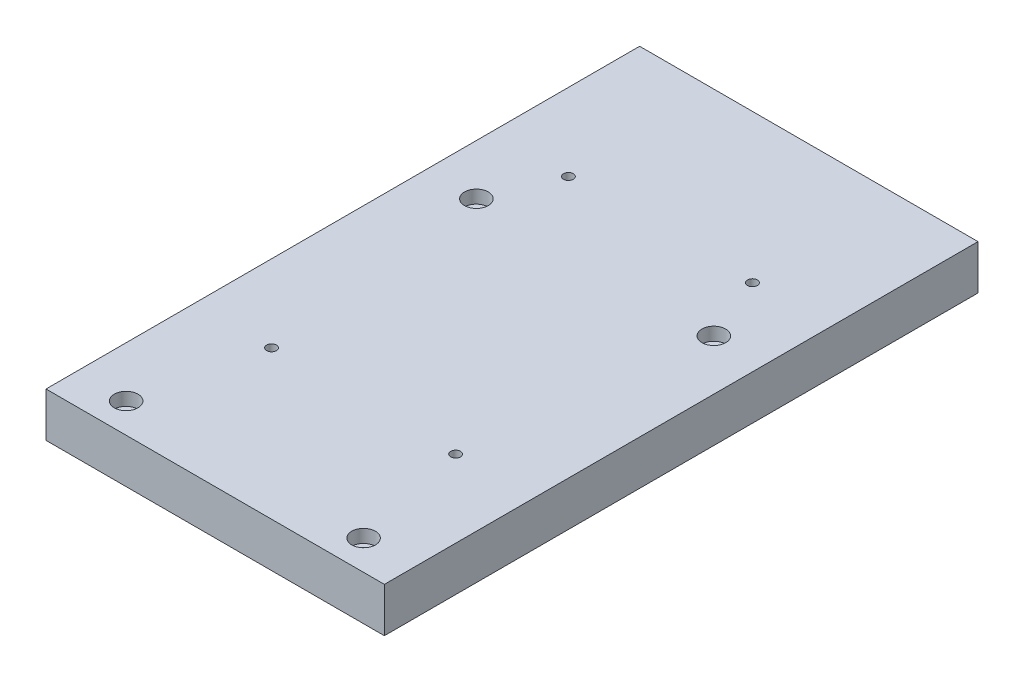
ISO-10303-21;
HEADER;
FILE_DESCRIPTION(('STEP AP214'),'2;1');
FILE_NAME('part.step','',(''),(''),'','','');
FILE_SCHEMA(('AUTOMOTIVE_DESIGN { 1 0 10303 214 1 1 1 1 }'));
ENDSEC;
DATA;
#1=APPLICATION_CONTEXT('core data for automotive mechanical design processes');
#2=APPLICATION_PROTOCOL_DEFINITION('international standard','automotive_design',2000,#1);
#3=PRODUCT_CONTEXT('',#1,'mechanical');
#4=PRODUCT('Part','Part','',(#3));
#5=PRODUCT_RELATED_PRODUCT_CATEGORY('part','',(#4));
#6=PRODUCT_DEFINITION_FORMATION('','',#4);
#7=PRODUCT_DEFINITION_CONTEXT('part definition',#1,'design');
#8=PRODUCT_DEFINITION('design','',#6,#7);
#9=PRODUCT_DEFINITION_SHAPE('','',#8);
#10=(LENGTH_UNIT() NAMED_UNIT(*) SI_UNIT(.MILLI.,.METRE.));
#11=(NAMED_UNIT(*) PLANE_ANGLE_UNIT() SI_UNIT($,.RADIAN.));
#12=(NAMED_UNIT(*) SI_UNIT($,.STERADIAN.) SOLID_ANGLE_UNIT());
#13=UNCERTAINTY_MEASURE_WITH_UNIT(LENGTH_MEASURE(1.E-05),#10,'distance_accuracy_value','');
#14=(GEOMETRIC_REPRESENTATION_CONTEXT(3) GLOBAL_UNCERTAINTY_ASSIGNED_CONTEXT((#13)) GLOBAL_UNIT_ASSIGNED_CONTEXT((#10,
#11,#12)) REPRESENTATION_CONTEXT('',''));
#15=CARTESIAN_POINT('',(0.,0.,0.));
#16=DIRECTION('',(0.,0.,1.));
#17=DIRECTION('',(1.,0.,0.));
#18=AXIS2_PLACEMENT_3D('',#15,#16,#17);
#19=CARTESIAN_POINT('',(31.,15.,-50.));
#20=DIRECTION('',(0.,1.,0.));
#21=DIRECTION('',(0.,0.,1.));
#22=AXIS2_PLACEMENT_3D('',#19,#20,#21);
#23=CYLINDRICAL_SURFACE('',#22,1.65);
#24=CARTESIAN_POINT('',(31.,4.9,-50.));
#25=DIRECTION('',(0.,1.,0.));
#26=DIRECTION('',(0.,0.,1.));
#27=AXIS2_PLACEMENT_3D('',#24,#25,#26);
#28=CIRCLE('',#27,1.65);
#29=CARTESIAN_POINT('',(31.,4.9,-48.35));
#30=VERTEX_POINT('',#29);
#31=EDGE_CURVE('E11',#30,#30,#28,.T.);
#32=ORIENTED_EDGE('',*,*,#31,.F.);
#33=EDGE_LOOP('',(#32));
#34=FACE_BOUND('',#33,.T.);
#35=CARTESIAN_POINT('',(31.,15.,-50.));
#36=DIRECTION('',(0.,1.,0.));
#37=DIRECTION('',(0.,0.,1.));
#38=AXIS2_PLACEMENT_3D('',#35,#36,#37);
#39=CIRCLE('',#38,1.64999999999999);
#40=CARTESIAN_POINT('',(31.,15.,-48.35));
#41=VERTEX_POINT('',#40);
#42=EDGE_CURVE('E45',#41,#41,#39,.T.);
#43=ORIENTED_EDGE('',*,*,#42,.T.);
#44=EDGE_LOOP('',(#43));
#45=FACE_BOUND('',#44,.T.);
#46=ADVANCED_FACE('F38',(#34,#45),#23,.F.);
#47=CARTESIAN_POINT('',(31.,4.9,-50.));
#48=DIRECTION('',(0.,1.,0.));
#49=DIRECTION('',(0.,0.,1.));
#50=AXIS2_PLACEMENT_3D('',#47,#48,#49);
#51=CONICAL_SURFACE('',#50,1.65,1.02974425867665);
#52=CARTESIAN_POINT('',(31.,3.90857997860452,-50.));
#53=VERTEX_POINT('',#52);
#54=VERTEX_LOOP('',#53);
#55=FACE_BOUND('',#54,.T.);
#56=ORIENTED_EDGE('',*,*,#31,.T.);
#57=EDGE_LOOP('',(#56));
#58=FACE_BOUND('',#57,.T.);
#59=ADVANCED_FACE('F210',(#55,#58),#51,.F.);
#60=CARTESIAN_POINT('',(31.,15.,50.));
#61=DIRECTION('',(0.,1.,0.));
#62=DIRECTION('',(0.,0.,1.));
#63=AXIS2_PLACEMENT_3D('',#60,#61,#62);
#64=CYLINDRICAL_SURFACE('',#63,1.65);
#65=CARTESIAN_POINT('',(31.,4.9,50.));
#66=DIRECTION('',(0.,1.,0.));
#67=DIRECTION('',(0.,0.,1.));
#68=AXIS2_PLACEMENT_3D('',#65,#66,#67);
#69=CIRCLE('',#68,1.65);
#70=CARTESIAN_POINT('',(31.,4.9,51.65));
#71=VERTEX_POINT('',#70);
#72=EDGE_CURVE('E184',#71,#71,#69,.T.);
#73=ORIENTED_EDGE('',*,*,#72,.F.);
#74=EDGE_LOOP('',(#73));
#75=FACE_BOUND('',#74,.T.);
#76=CARTESIAN_POINT('',(31.,15.,50.));
#77=DIRECTION('',(0.,1.,0.));
#78=DIRECTION('',(0.,0.,1.));
#79=AXIS2_PLACEMENT_3D('',#76,#77,#78);
#80=CIRCLE('',#79,1.64999999999999);
#81=CARTESIAN_POINT('',(31.,15.,51.65));
#82=VERTEX_POINT('',#81);
#83=EDGE_CURVE('E181',#82,#82,#80,.T.);
#84=ORIENTED_EDGE('',*,*,#83,.T.);
#85=EDGE_LOOP('',(#84));
#86=FACE_BOUND('',#85,.T.);
#87=ADVANCED_FACE('F215',(#75,#86),#64,.F.);
#88=CARTESIAN_POINT('',(31.,4.9,50.));
#89=DIRECTION('',(0.,1.,0.));
#90=DIRECTION('',(0.,0.,1.));
#91=AXIS2_PLACEMENT_3D('',#88,#89,#90);
#92=CONICAL_SURFACE('',#91,1.65,1.02974425867665);
#93=CARTESIAN_POINT('',(31.,3.90857997860452,50.));
#94=VERTEX_POINT('',#93);
#95=VERTEX_LOOP('',#94);
#96=FACE_BOUND('',#95,.T.);
#97=ORIENTED_EDGE('',*,*,#72,.T.);
#98=EDGE_LOOP('',(#97));
#99=FACE_BOUND('',#98,.T.);
#100=ADVANCED_FACE('F221',(#96,#99),#92,.F.);
#101=CARTESIAN_POINT('',(40.,15.,-28.));
#102=DIRECTION('',(0.,1.,0.));
#103=DIRECTION('',(0.,0.,1.));
#104=AXIS2_PLACEMENT_3D('',#101,#102,#103);
#105=CYLINDRICAL_SURFACE('',#104,4.);
#106=CARTESIAN_POINT('',(40.,10.6,-28.));
#107=DIRECTION('',(0.,1.,0.));
#108=DIRECTION('',(0.,0.,1.));
#109=AXIS2_PLACEMENT_3D('',#106,#107,#108);
#110=CIRCLE('',#109,4.);
#111=CARTESIAN_POINT('',(40.,10.6,-24.));
#112=VERTEX_POINT('',#111);
#113=EDGE_CURVE('E178',#112,#112,#110,.T.);
#114=ORIENTED_EDGE('',*,*,#113,.F.);
#115=EDGE_LOOP('',(#114));
#116=FACE_BOUND('',#115,.T.);
#117=CARTESIAN_POINT('',(40.,15.,-28.));
#118=DIRECTION('',(0.,1.,0.));
#119=DIRECTION('',(0.,0.,1.));
#120=AXIS2_PLACEMENT_3D('',#117,#118,#119);
#121=CIRCLE('',#120,4.);
#122=CARTESIAN_POINT('',(40.,15.,-24.));
#123=VERTEX_POINT('',#122);
#124=EDGE_CURVE('E169',#123,#123,#121,.T.);
#125=ORIENTED_EDGE('',*,*,#124,.T.);
#126=EDGE_LOOP('',(#125));
#127=FACE_BOUND('',#126,.T.);
#128=ADVANCED_FACE('F227',(#116,#127),#105,.F.);
#129=CARTESIAN_POINT('',(42.25,10.6,-28.));
#130=DIRECTION('',(0.,-1.,0.));
#131=DIRECTION('',(0.,0.,-1.));
#132=AXIS2_PLACEMENT_3D('',#129,#130,#131);
#133=PLANE('',#132);
#134=CARTESIAN_POINT('',(40.,10.6,-28.));
#135=DIRECTION('',(0.,1.,0.));
#136=DIRECTION('',(0.,0.,1.));
#137=AXIS2_PLACEMENT_3D('',#134,#135,#136);
#138=CIRCLE('',#137,2.25);
#139=CARTESIAN_POINT('',(40.,10.6,-25.75));
#140=VERTEX_POINT('',#139);
#141=EDGE_CURVE('E175',#140,#140,#138,.T.);
#142=ORIENTED_EDGE('',*,*,#141,.F.);
#143=EDGE_LOOP('',(#142));
#144=FACE_BOUND('',#143,.T.);
#145=ORIENTED_EDGE('',*,*,#113,.T.);
#146=EDGE_LOOP('',(#145));
#147=FACE_BOUND('',#146,.T.);
#148=ADVANCED_FACE('F230',(#144,#147),#133,.F.);
#149=CARTESIAN_POINT('',(40.,15.,-28.));
#150=DIRECTION('',(0.,1.,0.));
#151=DIRECTION('',(0.,0.,1.));
#152=AXIS2_PLACEMENT_3D('',#149,#150,#151);
#153=CYLINDRICAL_SURFACE('',#152,2.25);
#154=CARTESIAN_POINT('',(40.,0.,-28.));
#155=DIRECTION('',(0.,1.,0.));
#156=DIRECTION('',(0.,0.,1.));
#157=AXIS2_PLACEMENT_3D('',#154,#155,#156);
#158=CIRCLE('',#157,2.25);
#159=CARTESIAN_POINT('',(40.,0.,-25.75));
#160=VERTEX_POINT('',#159);
#161=EDGE_CURVE('E172',#160,#160,#158,.T.);
#162=ORIENTED_EDGE('',*,*,#161,.F.);
#163=EDGE_LOOP('',(#162));
#164=FACE_BOUND('',#163,.T.);
#165=ORIENTED_EDGE('',*,*,#141,.T.);
#166=EDGE_LOOP('',(#165));
#167=FACE_BOUND('',#166,.T.);
#168=ADVANCED_FACE('F234',(#164,#167),#153,.F.);
#169=CARTESIAN_POINT('',(40.,15.,90.));
#170=DIRECTION('',(0.,1.,0.));
#171=DIRECTION('',(0.,0.,1.));
#172=AXIS2_PLACEMENT_3D('',#169,#170,#171);
#173=CYLINDRICAL_SURFACE('',#172,4.);
#174=CARTESIAN_POINT('',(40.,10.6,90.));
#175=DIRECTION('',(0.,1.,0.));
#176=DIRECTION('',(0.,0.,1.));
#177=AXIS2_PLACEMENT_3D('',#174,#175,#176);
#178=CIRCLE('',#177,4.);
#179=CARTESIAN_POINT('',(40.,10.6,94.));
#180=VERTEX_POINT('',#179);
#181=EDGE_CURVE('E166',#180,#180,#178,.T.);
#182=ORIENTED_EDGE('',*,*,#181,.F.);
#183=EDGE_LOOP('',(#182));
#184=FACE_BOUND('',#183,.T.);
#185=CARTESIAN_POINT('',(40.,15.,90.));
#186=DIRECTION('',(0.,1.,0.));
#187=DIRECTION('',(0.,0.,1.));
#188=AXIS2_PLACEMENT_3D('',#185,#186,#187);
#189=CIRCLE('',#188,4.);
#190=CARTESIAN_POINT('',(40.,15.,94.));
#191=VERTEX_POINT('',#190);
#192=EDGE_CURVE('E157',#191,#191,#189,.T.);
#193=ORIENTED_EDGE('',*,*,#192,.T.);
#194=EDGE_LOOP('',(#193));
#195=FACE_BOUND('',#194,.T.);
#196=ADVANCED_FACE('F238',(#184,#195),#173,.F.);
#197=CARTESIAN_POINT('',(42.25,10.6,90.));
#198=DIRECTION('',(0.,-1.,0.));
#199=DIRECTION('',(0.,0.,-1.));
#200=AXIS2_PLACEMENT_3D('',#197,#198,#199);
#201=PLANE('',#200);
#202=CARTESIAN_POINT('',(40.,10.6,90.));
#203=DIRECTION('',(0.,1.,0.));
#204=DIRECTION('',(0.,0.,1.));
#205=AXIS2_PLACEMENT_3D('',#202,#203,#204);
#206=CIRCLE('',#205,2.25);
#207=CARTESIAN_POINT('',(40.,10.6,92.25));
#208=VERTEX_POINT('',#207);
#209=EDGE_CURVE('E163',#208,#208,#206,.T.);
#210=ORIENTED_EDGE('',*,*,#209,.F.);
#211=EDGE_LOOP('',(#210));
#212=FACE_BOUND('',#211,.T.);
#213=ORIENTED_EDGE('',*,*,#181,.T.);
#214=EDGE_LOOP('',(#213));
#215=FACE_BOUND('',#214,.T.);
#216=ADVANCED_FACE('F242',(#212,#215),#201,.F.);
#217=CARTESIAN_POINT('',(40.,15.,90.));
#218=DIRECTION('',(0.,1.,0.));
#219=DIRECTION('',(0.,0.,1.));
#220=AXIS2_PLACEMENT_3D('',#217,#218,#219);
#221=CYLINDRICAL_SURFACE('',#220,2.25);
#222=CARTESIAN_POINT('',(40.,0.,90.));
#223=DIRECTION('',(0.,1.,0.));
#224=DIRECTION('',(0.,0.,1.));
#225=AXIS2_PLACEMENT_3D('',#222,#223,#224);
#226=CIRCLE('',#225,2.25);
#227=CARTESIAN_POINT('',(40.,0.,92.25));
#228=VERTEX_POINT('',#227);
#229=EDGE_CURVE('E160',#228,#228,#226,.T.);
#230=ORIENTED_EDGE('',*,*,#229,.F.);
#231=EDGE_LOOP('',(#230));
#232=FACE_BOUND('',#231,.T.);
#233=ORIENTED_EDGE('',*,*,#209,.T.);
#234=EDGE_LOOP('',(#233));
#235=FACE_BOUND('',#234,.T.);
#236=ADVANCED_FACE('F246',(#232,#235),#221,.F.);
#237=CARTESIAN_POINT('',(57.,15.,-100.));
#238=DIRECTION('',(-1.,0.,0.));
#239=DIRECTION('',(0.,0.,1.));
#240=AXIS2_PLACEMENT_3D('',#237,#238,#239);
#241=PLANE('',#240);
#242=DIRECTION('',(0.,0.,-1.));
#243=VECTOR('',#242,1.);
#244=CARTESIAN_POINT('',(57.,0.,-100.));
#245=LINE('',#244,#243);
#246=CARTESIAN_POINT('',(57.,0.,100.));
#247=VERTEX_POINT('',#246);
#248=CARTESIAN_POINT('',(57.,0.,-100.));
#249=VERTEX_POINT('',#248);
#250=EDGE_CURVE('E127',#247,#249,#245,.T.);
#251=ORIENTED_EDGE('',*,*,#250,.T.);
#252=DIRECTION('',(0.,-1.,0.));
#253=VECTOR('',#252,1.);
#254=CARTESIAN_POINT('',(57.,15.,-100.));
#255=LINE('',#254,#253);
#256=CARTESIAN_POINT('',(57.,15.,-100.));
#257=VERTEX_POINT('',#256);
#258=EDGE_CURVE('E154',#257,#249,#255,.T.);
#259=ORIENTED_EDGE('',*,*,#258,.F.);
#260=DIRECTION('',(0.,0.,-1.));
#261=VECTOR('',#260,1.);
#262=CARTESIAN_POINT('',(57.,15.,-100.));
#263=LINE('',#262,#261);
#264=CARTESIAN_POINT('',(57.,15.,100.));
#265=VERTEX_POINT('',#264);
#266=EDGE_CURVE('E128',#265,#257,#263,.T.);
#267=ORIENTED_EDGE('',*,*,#266,.F.);
#268=DIRECTION('',(0.,-1.,0.));
#269=VECTOR('',#268,1.);
#270=CARTESIAN_POINT('',(57.,15.,100.));
#271=LINE('',#270,#269);
#272=EDGE_CURVE('E138',#265,#247,#271,.T.);
#273=ORIENTED_EDGE('',*,*,#272,.T.);
#274=EDGE_LOOP('',(#251,#259,#267,#273));
#275=FACE_BOUND('',#274,.T.);
#276=ADVANCED_FACE('F250',(#275),#241,.F.);
#277=CARTESIAN_POINT('',(-57.,15.,-100.));
#278=DIRECTION('',(0.,0.,1.));
#279=DIRECTION('',(1.,0.,0.));
#280=AXIS2_PLACEMENT_3D('',#277,#278,#279);
#281=PLANE('',#280);
#282=DIRECTION('',(-1.,0.,0.));
#283=VECTOR('',#282,1.);
#284=CARTESIAN_POINT('',(-57.,0.,-100.));
#285=LINE('',#284,#283);
#286=CARTESIAN_POINT('',(-57.,0.,-100.));
#287=VERTEX_POINT('',#286);
#288=EDGE_CURVE('E141',#249,#287,#285,.T.);
#289=ORIENTED_EDGE('',*,*,#288,.T.);
#290=DIRECTION('',(0.,-1.,0.));
#291=VECTOR('',#290,1.);
#292=CARTESIAN_POINT('',(-57.,15.,-100.));
#293=LINE('',#292,#291);
#294=CARTESIAN_POINT('',(-57.,15.,-100.));
#295=VERTEX_POINT('',#294);
#296=EDGE_CURVE('E151',#295,#287,#293,.T.);
#297=ORIENTED_EDGE('',*,*,#296,.F.);
#298=DIRECTION('',(-1.,0.,0.));
#299=VECTOR('',#298,1.);
#300=CARTESIAN_POINT('',(-57.,15.,-100.));
#301=LINE('',#300,#299);
#302=EDGE_CURVE('E131',#257,#295,#301,.T.);
#303=ORIENTED_EDGE('',*,*,#302,.F.);
#304=ORIENTED_EDGE('',*,*,#258,.T.);
#305=EDGE_LOOP('',(#289,#297,#303,#304));
#306=FACE_BOUND('',#305,.T.);
#307=ADVANCED_FACE('F254',(#306),#281,.F.);
#308=CARTESIAN_POINT('',(-57.,15.,-100.));
#309=DIRECTION('',(1.,0.,0.));
#310=DIRECTION('',(0.,0.,-1.));
#311=AXIS2_PLACEMENT_3D('',#308,#309,#310);
#312=PLANE('',#311);
#313=DIRECTION('',(0.,0.,1.));
#314=VECTOR('',#313,1.);
#315=CARTESIAN_POINT('',(-57.,0.,-100.));
#316=LINE('',#315,#314);
#317=CARTESIAN_POINT('',(-57.,0.,100.));
#318=VERTEX_POINT('',#317);
#319=EDGE_CURVE('E143',#287,#318,#316,.T.);
#320=ORIENTED_EDGE('',*,*,#319,.T.);
#321=DIRECTION('',(0.,-1.,0.));
#322=VECTOR('',#321,1.);
#323=CARTESIAN_POINT('',(-57.,15.,100.));
#324=LINE('',#323,#322);
#325=CARTESIAN_POINT('',(-57.,15.,100.));
#326=VERTEX_POINT('',#325);
#327=EDGE_CURVE('E148',#326,#318,#324,.T.);
#328=ORIENTED_EDGE('',*,*,#327,.F.);
#329=DIRECTION('',(0.,0.,1.));
#330=VECTOR('',#329,1.);
#331=CARTESIAN_POINT('',(-57.,15.,-100.));
#332=LINE('',#331,#330);
#333=EDGE_CURVE('E134',#295,#326,#332,.T.);
#334=ORIENTED_EDGE('',*,*,#333,.F.);
#335=ORIENTED_EDGE('',*,*,#296,.T.);
#336=EDGE_LOOP('',(#320,#328,#334,#335));
#337=FACE_BOUND('',#336,.T.);
#338=ADVANCED_FACE('F203',(#337),#312,.F.);
#339=CARTESIAN_POINT('',(-57.,15.,100.));
#340=DIRECTION('',(0.,0.,-1.));
#341=DIRECTION('',(-1.,0.,0.));
#342=AXIS2_PLACEMENT_3D('',#339,#340,#341);
#343=PLANE('',#342);
#344=DIRECTION('',(1.,0.,0.));
#345=VECTOR('',#344,1.);
#346=CARTESIAN_POINT('',(-57.,0.,100.));
#347=LINE('',#346,#345);
#348=EDGE_CURVE('E132',#318,#247,#347,.T.);
#349=ORIENTED_EDGE('',*,*,#348,.T.);
#350=ORIENTED_EDGE('',*,*,#272,.F.);
#351=DIRECTION('',(1.,0.,0.));
#352=VECTOR('',#351,1.);
#353=CARTESIAN_POINT('',(-57.,15.,100.));
#354=LINE('',#353,#352);
#355=EDGE_CURVE('E136',#326,#265,#354,.T.);
#356=ORIENTED_EDGE('',*,*,#355,.F.);
#357=ORIENTED_EDGE('',*,*,#327,.T.);
#358=EDGE_LOOP('',(#349,#350,#356,#357));
#359=FACE_BOUND('',#358,.T.);
#360=ADVANCED_FACE('F193',(#359),#343,.F.);
#361=CARTESIAN_POINT('',(0.,15.,0.));
#362=DIRECTION('',(0.,1.,0.));
#363=DIRECTION('',(0.,0.,1.));
#364=AXIS2_PLACEMENT_3D('',#361,#362,#363);
#365=PLANE('',#364);
#366=CARTESIAN_POINT('',(-31.,15.,-50.));
#367=DIRECTION('',(0.,1.,0.));
#368=DIRECTION('',(0.,0.,1.));
#369=AXIS2_PLACEMENT_3D('',#366,#367,#368);
#370=CIRCLE('',#369,1.64999999999999);
#371=CARTESIAN_POINT('',(-31.,15.,-48.35));
#372=VERTEX_POINT('',#371);
#373=EDGE_CURVE('E93',#372,#372,#370,.T.);
#374=ORIENTED_EDGE('',*,*,#373,.F.);
#375=EDGE_LOOP('',(#374));
#376=FACE_BOUND('',#375,.T.);
#377=CARTESIAN_POINT('',(-31.,15.,50.));
#378=DIRECTION('',(0.,1.,0.));
#379=DIRECTION('',(0.,0.,1.));
#380=AXIS2_PLACEMENT_3D('',#377,#378,#379);
#381=CIRCLE('',#380,1.64999999999999);
#382=CARTESIAN_POINT('',(-31.,15.,51.65));
#383=VERTEX_POINT('',#382);
#384=EDGE_CURVE('E92',#383,#383,#381,.T.);
#385=ORIENTED_EDGE('',*,*,#384,.F.);
#386=EDGE_LOOP('',(#385));
#387=FACE_BOUND('',#386,.T.);
#388=CARTESIAN_POINT('',(-40.,15.,-28.));
#389=DIRECTION('',(0.,1.,0.));
#390=DIRECTION('',(0.,0.,1.));
#391=AXIS2_PLACEMENT_3D('',#388,#389,#390);
#392=CIRCLE('',#391,4.);
#393=CARTESIAN_POINT('',(-40.,15.,-24.));
#394=VERTEX_POINT('',#393);
#395=EDGE_CURVE('E103',#394,#394,#392,.T.);
#396=ORIENTED_EDGE('',*,*,#395,.F.);
#397=EDGE_LOOP('',(#396));
#398=FACE_BOUND('',#397,.T.);
#399=CARTESIAN_POINT('',(-40.,15.,90.));
#400=DIRECTION('',(0.,1.,0.));
#401=DIRECTION('',(0.,0.,1.));
#402=AXIS2_PLACEMENT_3D('',#399,#400,#401);
#403=CIRCLE('',#402,4.);
#404=CARTESIAN_POINT('',(-40.,15.,94.));
#405=VERTEX_POINT('',#404);
#406=EDGE_CURVE('E115',#405,#405,#403,.T.);
#407=ORIENTED_EDGE('',*,*,#406,.F.);
#408=EDGE_LOOP('',(#407));
#409=FACE_BOUND('',#408,.T.);
#410=ORIENTED_EDGE('',*,*,#266,.T.);
#411=ORIENTED_EDGE('',*,*,#302,.T.);
#412=ORIENTED_EDGE('',*,*,#333,.T.);
#413=ORIENTED_EDGE('',*,*,#355,.T.);
#414=EDGE_LOOP('',(#410,#411,#412,#413));
#415=FACE_BOUND('',#414,.T.);
#416=ORIENTED_EDGE('',*,*,#192,.F.);
#417=EDGE_LOOP('',(#416));
#418=FACE_BOUND('',#417,.T.);
#419=ORIENTED_EDGE('',*,*,#124,.F.);
#420=EDGE_LOOP('',(#419));
#421=FACE_BOUND('',#420,.T.);
#422=ORIENTED_EDGE('',*,*,#83,.F.);
#423=EDGE_LOOP('',(#422));
#424=FACE_BOUND('',#423,.T.);
#425=ORIENTED_EDGE('',*,*,#42,.F.);
#426=EDGE_LOOP('',(#425));
#427=FACE_BOUND('',#426,.T.);
#428=ADVANCED_FACE('F190',(#376,#387,#398,#409,#415,#418,#421,#424,#427),#365,.T.);
#429=CARTESIAN_POINT('',(0.,0.,0.));
#430=DIRECTION('',(0.,1.,0.));
#431=DIRECTION('',(0.,0.,1.));
#432=AXIS2_PLACEMENT_3D('',#429,#430,#431);
#433=PLANE('',#432);
#434=CARTESIAN_POINT('',(-40.,0.,-28.));
#435=DIRECTION('',(0.,1.,0.));
#436=DIRECTION('',(0.,0.,1.));
#437=AXIS2_PLACEMENT_3D('',#434,#435,#436);
#438=CIRCLE('',#437,2.25);
#439=CARTESIAN_POINT('',(-40.,0.,-25.75));
#440=VERTEX_POINT('',#439);
#441=EDGE_CURVE('E106',#440,#440,#438,.T.);
#442=ORIENTED_EDGE('',*,*,#441,.T.);
#443=EDGE_LOOP('',(#442));
#444=FACE_BOUND('',#443,.T.);
#445=CARTESIAN_POINT('',(-40.,0.,90.));
#446=DIRECTION('',(0.,1.,0.));
#447=DIRECTION('',(0.,0.,1.));
#448=AXIS2_PLACEMENT_3D('',#445,#446,#447);
#449=CIRCLE('',#448,2.25);
#450=CARTESIAN_POINT('',(-40.,0.,92.25));
#451=VERTEX_POINT('',#450);
#452=EDGE_CURVE('E124',#451,#451,#449,.T.);
#453=ORIENTED_EDGE('',*,*,#452,.T.);
#454=EDGE_LOOP('',(#453));
#455=FACE_BOUND('',#454,.T.);
#456=ORIENTED_EDGE('',*,*,#250,.F.);
#457=ORIENTED_EDGE('',*,*,#348,.F.);
#458=ORIENTED_EDGE('',*,*,#319,.F.);
#459=ORIENTED_EDGE('',*,*,#288,.F.);
#460=EDGE_LOOP('',(#456,#457,#458,#459));
#461=FACE_BOUND('',#460,.T.);
#462=ORIENTED_EDGE('',*,*,#229,.T.);
#463=EDGE_LOOP('',(#462));
#464=FACE_BOUND('',#463,.T.);
#465=ORIENTED_EDGE('',*,*,#161,.T.);
#466=EDGE_LOOP('',(#465));
#467=FACE_BOUND('',#466,.T.);
#468=ADVANCED_FACE('F192',(#444,#455,#461,#464,#467),#433,.F.);
#469=CARTESIAN_POINT('',(-40.,15.,90.));
#470=DIRECTION('',(0.,1.,0.));
#471=DIRECTION('',(0.,0.,1.));
#472=AXIS2_PLACEMENT_3D('',#469,#470,#471);
#473=CYLINDRICAL_SURFACE('',#472,2.25);
#474=ORIENTED_EDGE('',*,*,#452,.F.);
#475=EDGE_LOOP('',(#474));
#476=FACE_BOUND('',#475,.T.);
#477=CARTESIAN_POINT('',(-40.,10.6,90.));
#478=DIRECTION('',(0.,1.,0.));
#479=DIRECTION('',(0.,0.,1.));
#480=AXIS2_PLACEMENT_3D('',#477,#478,#479);
#481=CIRCLE('',#480,2.25);
#482=CARTESIAN_POINT('',(-40.,10.6,92.25));
#483=VERTEX_POINT('',#482);
#484=EDGE_CURVE('E121',#483,#483,#481,.T.);
#485=ORIENTED_EDGE('',*,*,#484,.T.);
#486=EDGE_LOOP('',(#485));
#487=FACE_BOUND('',#486,.T.);
#488=ADVANCED_FACE('F200',(#476,#487),#473,.F.);
#489=CARTESIAN_POINT('',(-37.75,10.6,90.));
#490=DIRECTION('',(0.,-1.,0.));
#491=DIRECTION('',(0.,0.,-1.));
#492=AXIS2_PLACEMENT_3D('',#489,#490,#491);
#493=PLANE('',#492);
#494=ORIENTED_EDGE('',*,*,#484,.F.);
#495=EDGE_LOOP('',(#494));
#496=FACE_BOUND('',#495,.T.);
#497=CARTESIAN_POINT('',(-40.,10.6,90.));
#498=DIRECTION('',(0.,1.,0.));
#499=DIRECTION('',(0.,0.,1.));
#500=AXIS2_PLACEMENT_3D('',#497,#498,#499);
#501=CIRCLE('',#500,4.);
#502=CARTESIAN_POINT('',(-40.,10.6,94.));
#503=VERTEX_POINT('',#502);
#504=EDGE_CURVE('E118',#503,#503,#501,.T.);
#505=ORIENTED_EDGE('',*,*,#504,.T.);
#506=EDGE_LOOP('',(#505));
#507=FACE_BOUND('',#506,.T.);
#508=ADVANCED_FACE('F312',(#496,#507),#493,.F.);
#509=CARTESIAN_POINT('',(-40.,15.,90.));
#510=DIRECTION('',(0.,1.,0.));
#511=DIRECTION('',(0.,0.,1.));
#512=AXIS2_PLACEMENT_3D('',#509,#510,#511);
#513=CYLINDRICAL_SURFACE('',#512,4.);
#514=ORIENTED_EDGE('',*,*,#504,.F.);
#515=EDGE_LOOP('',(#514));
#516=FACE_BOUND('',#515,.T.);
#517=ORIENTED_EDGE('',*,*,#406,.T.);
#518=EDGE_LOOP('',(#517));
#519=FACE_BOUND('',#518,.T.);
#520=ADVANCED_FACE('F322',(#516,#519),#513,.F.);
#521=CARTESIAN_POINT('',(-40.,15.,-28.));
#522=DIRECTION('',(0.,1.,0.));
#523=DIRECTION('',(0.,0.,1.));
#524=AXIS2_PLACEMENT_3D('',#521,#522,#523);
#525=CYLINDRICAL_SURFACE('',#524,2.25);
#526=ORIENTED_EDGE('',*,*,#441,.F.);
#527=EDGE_LOOP('',(#526));
#528=FACE_BOUND('',#527,.T.);
#529=CARTESIAN_POINT('',(-40.,10.6,-28.));
#530=DIRECTION('',(0.,1.,0.));
#531=DIRECTION('',(0.,0.,1.));
#532=AXIS2_PLACEMENT_3D('',#529,#530,#531);
#533=CIRCLE('',#532,2.25);
#534=CARTESIAN_POINT('',(-40.,10.6,-25.75));
#535=VERTEX_POINT('',#534);
#536=EDGE_CURVE('E112',#535,#535,#533,.T.);
#537=ORIENTED_EDGE('',*,*,#536,.T.);
#538=EDGE_LOOP('',(#537));
#539=FACE_BOUND('',#538,.T.);
#540=ADVANCED_FACE('F332',(#528,#539),#525,.F.);
#541=CARTESIAN_POINT('',(-37.75,10.6,-28.));
#542=DIRECTION('',(0.,-1.,0.));
#543=DIRECTION('',(0.,0.,-1.));
#544=AXIS2_PLACEMENT_3D('',#541,#542,#543);
#545=PLANE('',#544);
#546=ORIENTED_EDGE('',*,*,#536,.F.);
#547=EDGE_LOOP('',(#546));
#548=FACE_BOUND('',#547,.T.);
#549=CARTESIAN_POINT('',(-40.,10.6,-28.));
#550=DIRECTION('',(0.,1.,0.));
#551=DIRECTION('',(0.,0.,1.));
#552=AXIS2_PLACEMENT_3D('',#549,#550,#551);
#553=CIRCLE('',#552,4.);
#554=CARTESIAN_POINT('',(-40.,10.6,-24.));
#555=VERTEX_POINT('',#554);
#556=EDGE_CURVE('E109',#555,#555,#553,.T.);
#557=ORIENTED_EDGE('',*,*,#556,.T.);
#558=EDGE_LOOP('',(#557));
#559=FACE_BOUND('',#558,.T.);
#560=ADVANCED_FACE('F383',(#548,#559),#545,.F.);
#561=CARTESIAN_POINT('',(-40.,15.,-28.));
#562=DIRECTION('',(0.,1.,0.));
#563=DIRECTION('',(0.,0.,1.));
#564=AXIS2_PLACEMENT_3D('',#561,#562,#563);
#565=CYLINDRICAL_SURFACE('',#564,4.);
#566=ORIENTED_EDGE('',*,*,#556,.F.);
#567=EDGE_LOOP('',(#566));
#568=FACE_BOUND('',#567,.T.);
#569=ORIENTED_EDGE('',*,*,#395,.T.);
#570=EDGE_LOOP('',(#569));
#571=FACE_BOUND('',#570,.T.);
#572=ADVANCED_FACE('F393',(#568,#571),#565,.F.);
#573=CARTESIAN_POINT('',(-31.,4.9,50.));
#574=DIRECTION('',(0.,1.,0.));
#575=DIRECTION('',(0.,0.,1.));
#576=AXIS2_PLACEMENT_3D('',#573,#574,#575);
#577=CONICAL_SURFACE('',#576,1.65,1.02974425867665);
#578=CARTESIAN_POINT('',(-31.,3.90857997860452,50.));
#579=VERTEX_POINT('',#578);
#580=VERTEX_LOOP('',#579);
#581=FACE_BOUND('',#580,.T.);
#582=CARTESIAN_POINT('',(-31.,4.9,50.));
#583=DIRECTION('',(0.,1.,0.));
#584=DIRECTION('',(0.,0.,1.));
#585=AXIS2_PLACEMENT_3D('',#582,#583,#584);
#586=CIRCLE('',#585,1.65);
#587=CARTESIAN_POINT('',(-31.,4.9,51.65));
#588=VERTEX_POINT('',#587);
#589=EDGE_CURVE('E96',#588,#588,#586,.T.);
#590=ORIENTED_EDGE('',*,*,#589,.T.);
#591=EDGE_LOOP('',(#590));
#592=FACE_BOUND('',#591,.T.);
#593=ADVANCED_FACE('F403',(#581,#592),#577,.F.);
#594=CARTESIAN_POINT('',(-31.,15.,50.));
#595=DIRECTION('',(0.,1.,0.));
#596=DIRECTION('',(0.,0.,1.));
#597=AXIS2_PLACEMENT_3D('',#594,#595,#596);
#598=CYLINDRICAL_SURFACE('',#597,1.65);
#599=ORIENTED_EDGE('',*,*,#589,.F.);
#600=EDGE_LOOP('',(#599));
#601=FACE_BOUND('',#600,.T.);
#602=ORIENTED_EDGE('',*,*,#384,.T.);
#603=EDGE_LOOP('',(#602));
#604=FACE_BOUND('',#603,.T.);
#605=ADVANCED_FACE('F86',(#601,#604),#598,.F.);
#606=CARTESIAN_POINT('',(-31.,4.9,-50.));
#607=DIRECTION('',(0.,1.,0.));
#608=DIRECTION('',(0.,0.,1.));
#609=AXIS2_PLACEMENT_3D('',#606,#607,#608);
#610=CONICAL_SURFACE('',#609,1.65,1.02974425867665);
#611=CARTESIAN_POINT('',(-31.,3.90857997860452,-50.));
#612=VERTEX_POINT('',#611);
#613=VERTEX_LOOP('',#612);
#614=FACE_BOUND('',#613,.T.);
#615=CARTESIAN_POINT('',(-31.,4.9,-50.));
#616=DIRECTION('',(0.,1.,0.));
#617=DIRECTION('',(0.,0.,1.));
#618=AXIS2_PLACEMENT_3D('',#615,#616,#617);
#619=CIRCLE('',#618,1.65);
#620=CARTESIAN_POINT('',(-31.,4.9,-48.35));
#621=VERTEX_POINT('',#620);
#622=EDGE_CURVE('E90',#621,#621,#619,.T.);
#623=ORIENTED_EDGE('',*,*,#622,.T.);
#624=EDGE_LOOP('',(#623));
#625=FACE_BOUND('',#624,.T.);
#626=ADVANCED_FACE('F82',(#614,#625),#610,.F.);
#627=CARTESIAN_POINT('',(-31.,15.,-50.));
#628=DIRECTION('',(0.,1.,0.));
#629=DIRECTION('',(0.,0.,1.));
#630=AXIS2_PLACEMENT_3D('',#627,#628,#629);
#631=CYLINDRICAL_SURFACE('',#630,1.65);
#632=ORIENTED_EDGE('',*,*,#622,.F.);
#633=EDGE_LOOP('',(#632));
#634=FACE_BOUND('',#633,.T.);
#635=ORIENTED_EDGE('',*,*,#373,.T.);
#636=EDGE_LOOP('',(#635));
#637=FACE_BOUND('',#636,.T.);
#638=ADVANCED_FACE('F85',(#634,#637),#631,.F.);
#639=CLOSED_SHELL('',(#46,#59,#87,#100,#128,#148,#168,#196,#216,#236,#276,#307,#338,#360,#428,
#468,#488,#508,#520,#540,#560,#572,#593,#605,#626,#638));
#640=MANIFOLD_SOLID_BREP('B2',#639);
#641=ADVANCED_BREP_SHAPE_REPRESENTATION('',(#18,#640),#14);
#642=SHAPE_DEFINITION_REPRESENTATION(#9,#641);
ENDSEC;
END-ISO-10303-21;
